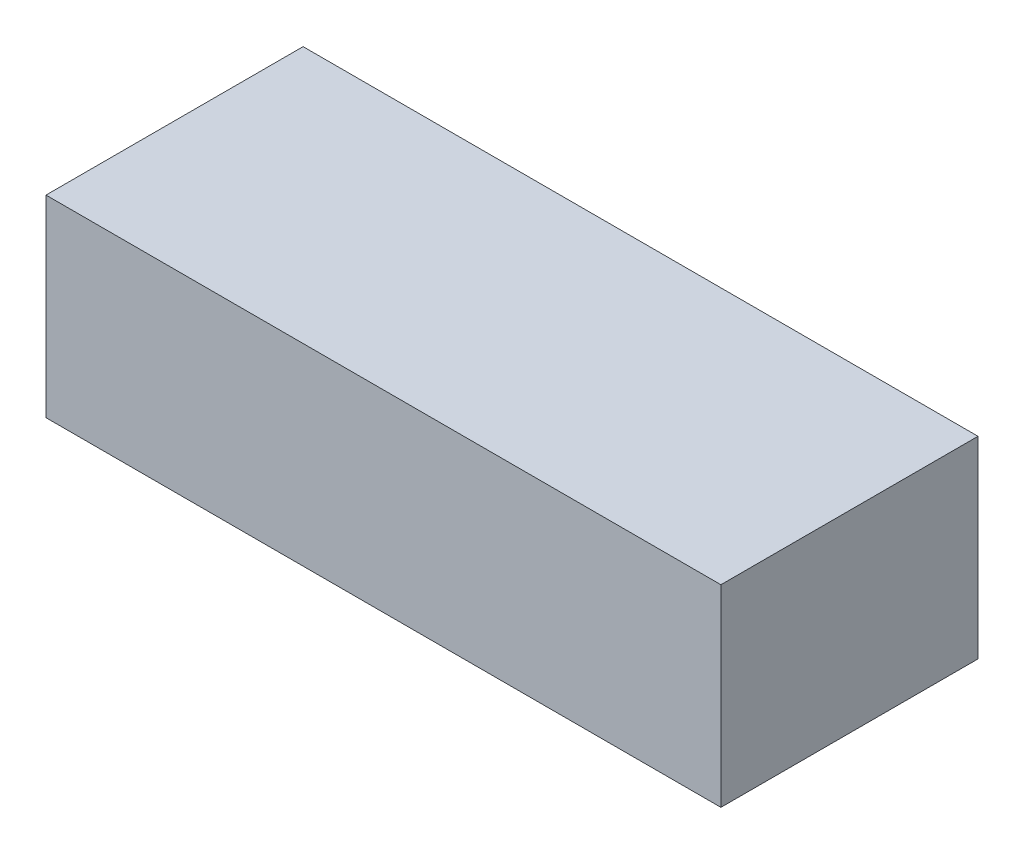
ISO-10303-21;
HEADER;
FILE_DESCRIPTION(('STEP AP214'),'2;1');
FILE_NAME('part.step','',(''),(''),'','','');
FILE_SCHEMA(('AUTOMOTIVE_DESIGN { 1 0 10303 214 1 1 1 1 }'));
ENDSEC;
DATA;
#1=APPLICATION_CONTEXT('core data for automotive mechanical design processes');
#2=APPLICATION_PROTOCOL_DEFINITION('international standard','automotive_design',2000,#1);
#3=PRODUCT_CONTEXT('',#1,'mechanical');
#4=PRODUCT('Part','Part','',(#3));
#5=PRODUCT_RELATED_PRODUCT_CATEGORY('part','',(#4));
#6=PRODUCT_DEFINITION_FORMATION('','',#4);
#7=PRODUCT_DEFINITION_CONTEXT('part definition',#1,'design');
#8=PRODUCT_DEFINITION('design','',#6,#7);
#9=PRODUCT_DEFINITION_SHAPE('','',#8);
#10=(LENGTH_UNIT() NAMED_UNIT(*) SI_UNIT(.MILLI.,.METRE.));
#11=(NAMED_UNIT(*) PLANE_ANGLE_UNIT() SI_UNIT($,.RADIAN.));
#12=(NAMED_UNIT(*) SI_UNIT($,.STERADIAN.) SOLID_ANGLE_UNIT());
#13=UNCERTAINTY_MEASURE_WITH_UNIT(LENGTH_MEASURE(1.E-05),#10,'distance_accuracy_value','');
#14=(GEOMETRIC_REPRESENTATION_CONTEXT(3) GLOBAL_UNCERTAINTY_ASSIGNED_CONTEXT((#13)) GLOBAL_UNIT_ASSIGNED_CONTEXT((#10,
#11,#12)) REPRESENTATION_CONTEXT('',''));
#15=CARTESIAN_POINT('',(0.,0.,0.));
#16=DIRECTION('',(0.,0.,1.));
#17=DIRECTION('',(1.,0.,0.));
#18=AXIS2_PLACEMENT_3D('',#15,#16,#17);
#19=CARTESIAN_POINT('',(-10.1978417266187,6.,-4.34352517985611));
#20=DIRECTION('',(1.,0.,0.));
#21=DIRECTION('',(0.,0.,-1.));
#22=AXIS2_PLACEMENT_3D('',#19,#20,#21);
#23=PLANE('',#22);
#24=DIRECTION('',(0.,0.,1.));
#25=VECTOR('',#24,1.);
#26=CARTESIAN_POINT('',(-10.1978417266187,0.,-4.34352517985611));
#27=LINE('',#26,#25);
#28=CARTESIAN_POINT('',(-10.1978417266187,0.,-4.34352517985611));
#29=VERTEX_POINT('',#28);
#30=CARTESIAN_POINT('',(-10.1978417266187,0.,3.65647482014389));
#31=VERTEX_POINT('',#30);
#32=EDGE_CURVE('E107',#29,#31,#27,.T.);
#33=ORIENTED_EDGE('',*,*,#32,.T.);
#34=DIRECTION('',(0.,-1.,0.));
#35=VECTOR('',#34,1.);
#36=CARTESIAN_POINT('',(-10.1978417266187,6.,3.65647482014389));
#37=LINE('',#36,#35);
#38=CARTESIAN_POINT('',(-10.1978417266187,6.,3.65647482014389));
#39=VERTEX_POINT('',#38);
#40=EDGE_CURVE('E11',#39,#31,#37,.T.);
#41=ORIENTED_EDGE('',*,*,#40,.F.);
#42=DIRECTION('',(0.,0.,1.));
#43=VECTOR('',#42,1.);
#44=CARTESIAN_POINT('',(-10.1978417266187,6.,-4.34352517985611));
#45=LINE('',#44,#43);
#46=CARTESIAN_POINT('',(-10.1978417266187,6.,-4.34352517985611));
#47=VERTEX_POINT('',#46);
#48=EDGE_CURVE('E91',#47,#39,#45,.T.);
#49=ORIENTED_EDGE('',*,*,#48,.F.);
#50=DIRECTION('',(0.,-1.,0.));
#51=VECTOR('',#50,1.);
#52=CARTESIAN_POINT('',(-10.1978417266187,6.,-4.34352517985611));
#53=LINE('',#52,#51);
#54=EDGE_CURVE('E103',#47,#29,#53,.T.);
#55=ORIENTED_EDGE('',*,*,#54,.T.);
#56=EDGE_LOOP('',(#33,#41,#49,#55));
#57=FACE_BOUND('',#56,.T.);
#58=ADVANCED_FACE('F39',(#57),#23,.F.);
#59=CARTESIAN_POINT('',(-10.1978417266187,6.,3.65647482014389));
#60=DIRECTION('',(0.,0.,-1.));
#61=DIRECTION('',(-1.,0.,0.));
#62=AXIS2_PLACEMENT_3D('',#59,#60,#61);
#63=PLANE('',#62);
#64=DIRECTION('',(1.,0.,0.));
#65=VECTOR('',#64,1.);
#66=CARTESIAN_POINT('',(-10.1978417266187,0.,3.65647482014389));
#67=LINE('',#66,#65);
#68=CARTESIAN_POINT('',(10.8021582733813,0.,3.65647482014389));
#69=VERTEX_POINT('',#68);
#70=EDGE_CURVE('E96',#31,#69,#67,.T.);
#71=ORIENTED_EDGE('',*,*,#70,.T.);
#72=DIRECTION('',(0.,-1.,0.));
#73=VECTOR('',#72,1.);
#74=CARTESIAN_POINT('',(10.8021582733813,6.,3.65647482014389));
#75=LINE('',#74,#73);
#76=CARTESIAN_POINT('',(10.8021582733813,6.,3.65647482014389));
#77=VERTEX_POINT('',#76);
#78=EDGE_CURVE('E48',#77,#69,#75,.T.);
#79=ORIENTED_EDGE('',*,*,#78,.F.);
#80=DIRECTION('',(1.,0.,0.));
#81=VECTOR('',#80,1.);
#82=CARTESIAN_POINT('',(-10.1978417266187,6.,3.65647482014389));
#83=LINE('',#82,#81);
#84=EDGE_CURVE('E86',#39,#77,#83,.T.);
#85=ORIENTED_EDGE('',*,*,#84,.F.);
#86=ORIENTED_EDGE('',*,*,#40,.T.);
#87=EDGE_LOOP('',(#71,#79,#85,#86));
#88=FACE_BOUND('',#87,.T.);
#89=ADVANCED_FACE('F95',(#88),#63,.F.);
#90=CARTESIAN_POINT('',(10.8021582733813,6.,-4.34352517985611));
#91=DIRECTION('',(-1.,0.,0.));
#92=DIRECTION('',(0.,0.,1.));
#93=AXIS2_PLACEMENT_3D('',#90,#91,#92);
#94=PLANE('',#93);
#95=DIRECTION('',(0.,0.,-1.));
#96=VECTOR('',#95,1.);
#97=CARTESIAN_POINT('',(10.8021582733813,0.,-4.34352517985611));
#98=LINE('',#97,#96);
#99=CARTESIAN_POINT('',(10.8021582733813,0.,-4.34352517985611));
#100=VERTEX_POINT('',#99);
#101=EDGE_CURVE('E73',#69,#100,#98,.T.);
#102=ORIENTED_EDGE('',*,*,#101,.T.);
#103=DIRECTION('',(0.,-1.,0.));
#104=VECTOR('',#103,1.);
#105=CARTESIAN_POINT('',(10.8021582733813,6.,-4.34352517985611));
#106=LINE('',#105,#104);
#107=CARTESIAN_POINT('',(10.8021582733813,6.,-4.34352517985611));
#108=VERTEX_POINT('',#107);
#109=EDGE_CURVE('E98',#108,#100,#106,.T.);
#110=ORIENTED_EDGE('',*,*,#109,.F.);
#111=DIRECTION('',(0.,0.,-1.));
#112=VECTOR('',#111,1.);
#113=CARTESIAN_POINT('',(10.8021582733813,6.,-4.34352517985611));
#114=LINE('',#113,#112);
#115=EDGE_CURVE('E89',#77,#108,#114,.T.);
#116=ORIENTED_EDGE('',*,*,#115,.F.);
#117=ORIENTED_EDGE('',*,*,#78,.T.);
#118=EDGE_LOOP('',(#102,#110,#116,#117));
#119=FACE_BOUND('',#118,.T.);
#120=ADVANCED_FACE('F99',(#119),#94,.F.);
#121=CARTESIAN_POINT('',(-10.1978417266187,6.,-4.34352517985611));
#122=DIRECTION('',(0.,0.,1.));
#123=DIRECTION('',(1.,0.,0.));
#124=AXIS2_PLACEMENT_3D('',#121,#122,#123);
#125=PLANE('',#124);
#126=DIRECTION('',(-1.,0.,0.));
#127=VECTOR('',#126,1.);
#128=CARTESIAN_POINT('',(-10.1978417266187,0.,-4.34352517985611));
#129=LINE('',#128,#127);
#130=EDGE_CURVE('E79',#100,#29,#129,.T.);
#131=ORIENTED_EDGE('',*,*,#130,.T.);
#132=ORIENTED_EDGE('',*,*,#54,.F.);
#133=DIRECTION('',(-1.,0.,0.));
#134=VECTOR('',#133,1.);
#135=CARTESIAN_POINT('',(-10.1978417266187,6.,-4.34352517985611));
#136=LINE('',#135,#134);
#137=EDGE_CURVE('E56',#108,#47,#136,.T.);
#138=ORIENTED_EDGE('',*,*,#137,.F.);
#139=ORIENTED_EDGE('',*,*,#109,.T.);
#140=EDGE_LOOP('',(#131,#132,#138,#139));
#141=FACE_BOUND('',#140,.T.);
#142=ADVANCED_FACE('F120',(#141),#125,.F.);
#143=CARTESIAN_POINT('',(0.,6.,0.));
#144=DIRECTION('',(0.,1.,0.));
#145=DIRECTION('',(0.,0.,1.));
#146=AXIS2_PLACEMENT_3D('',#143,#144,#145);
#147=PLANE('',#146);
#148=ORIENTED_EDGE('',*,*,#48,.T.);
#149=ORIENTED_EDGE('',*,*,#84,.T.);
#150=ORIENTED_EDGE('',*,*,#115,.T.);
#151=ORIENTED_EDGE('',*,*,#137,.T.);
#152=EDGE_LOOP('',(#148,#149,#150,#151));
#153=FACE_BOUND('',#152,.T.);
#154=ADVANCED_FACE('F87',(#153),#147,.T.);
#155=CARTESIAN_POINT('',(0.,0.,0.));
#156=DIRECTION('',(0.,1.,0.));
#157=DIRECTION('',(0.,0.,1.));
#158=AXIS2_PLACEMENT_3D('',#155,#156,#157);
#159=PLANE('',#158);
#160=ORIENTED_EDGE('',*,*,#32,.F.);
#161=ORIENTED_EDGE('',*,*,#130,.F.);
#162=ORIENTED_EDGE('',*,*,#101,.F.);
#163=ORIENTED_EDGE('',*,*,#70,.F.);
#164=EDGE_LOOP('',(#160,#161,#162,#163));
#165=FACE_BOUND('',#164,.T.);
#166=ADVANCED_FACE('F123',(#165),#159,.F.);
#167=CLOSED_SHELL('',(#58,#89,#120,#142,#154,#166));
#168=MANIFOLD_SOLID_BREP('B2',#167);
#169=ADVANCED_BREP_SHAPE_REPRESENTATION('',(#18,#168),#14);
#170=SHAPE_DEFINITION_REPRESENTATION(#9,#169);
ENDSEC;
END-ISO-10303-21;
